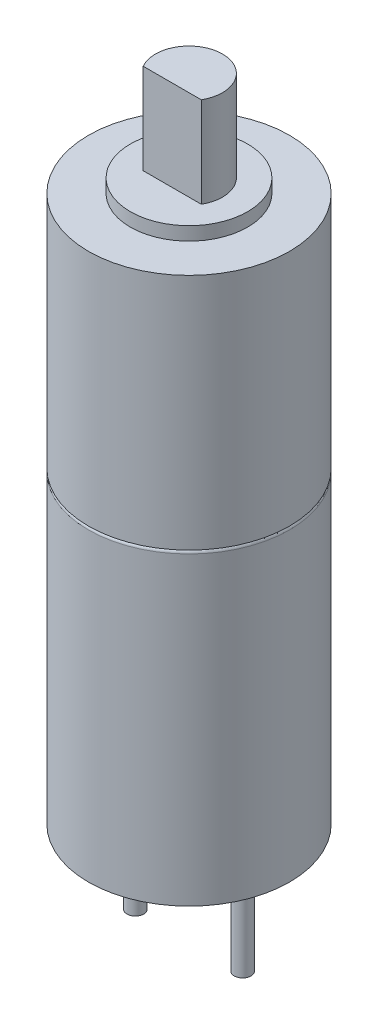
ISO-10303-21;
HEADER;
FILE_DESCRIPTION(('STEP AP214'),'2;1');
FILE_NAME('part.step','',(''),(''),'','','');
FILE_SCHEMA(('AUTOMOTIVE_DESIGN { 1 0 10303 214 1 1 1 1 }'));
ENDSEC;
DATA;
#1=APPLICATION_CONTEXT('core data for automotive mechanical design processes');
#2=APPLICATION_PROTOCOL_DEFINITION('international standard','automotive_design',2000,#1);
#3=PRODUCT_CONTEXT('',#1,'mechanical');
#4=PRODUCT('Part','Part','',(#3));
#5=PRODUCT_RELATED_PRODUCT_CATEGORY('part','',(#4));
#6=PRODUCT_DEFINITION_FORMATION('','',#4);
#7=PRODUCT_DEFINITION_CONTEXT('part definition',#1,'design');
#8=PRODUCT_DEFINITION('design','',#6,#7);
#9=PRODUCT_DEFINITION_SHAPE('','',#8);
#10=(LENGTH_UNIT() NAMED_UNIT(*) SI_UNIT(.MILLI.,.METRE.));
#11=(NAMED_UNIT(*) PLANE_ANGLE_UNIT() SI_UNIT($,.RADIAN.));
#12=(NAMED_UNIT(*) SI_UNIT($,.STERADIAN.) SOLID_ANGLE_UNIT());
#13=UNCERTAINTY_MEASURE_WITH_UNIT(LENGTH_MEASURE(1.E-05),#10,'distance_accuracy_value','');
#14=(GEOMETRIC_REPRESENTATION_CONTEXT(3) GLOBAL_UNCERTAINTY_ASSIGNED_CONTEXT((#13)) GLOBAL_UNIT_ASSIGNED_CONTEXT((#10,
#11,#12)) REPRESENTATION_CONTEXT('',''));
#15=CARTESIAN_POINT('',(0.,0.,0.));
#16=DIRECTION('',(0.,0.,1.));
#17=DIRECTION('',(1.,0.,0.));
#18=AXIS2_PLACEMENT_3D('',#15,#16,#17);
#19=CARTESIAN_POINT('',(0.,16.7,0.));
#20=DIRECTION('',(0.,1.,0.));
#21=DIRECTION('',(0.,0.,1.));
#22=AXIS2_PLACEMENT_3D('',#19,#20,#21);
#23=PLANE('',#22);
#24=CARTESIAN_POINT('',(0.,16.7,0.));
#25=DIRECTION('',(0.,1.,0.));
#26=DIRECTION('',(0.,0.,1.));
#27=AXIS2_PLACEMENT_3D('',#24,#25,#26);
#28=CIRCLE('',#27,1.75);
#29=CARTESIAN_POINT('',(0.,16.7,1.75));
#30=VERTEX_POINT('',#29);
#31=EDGE_CURVE('E79',#30,#30,#28,.T.);
#32=ORIENTED_EDGE('',*,*,#31,.T.);
#33=EDGE_LOOP('',(#32));
#34=FACE_BOUND('',#33,.T.);
#35=DIRECTION('',(-1.,0.,0.));
#36=VECTOR('',#35,1.);
#37=CARTESIAN_POINT('',(0.,16.7,0.5));
#38=LINE('',#37,#36);
#39=CARTESIAN_POINT('',(0.866025403784439,16.7,0.5));
#40=VERTEX_POINT('',#39);
#41=CARTESIAN_POINT('',(-0.866025403784439,16.7,0.5));
#42=VERTEX_POINT('',#41);
#43=EDGE_CURVE('E56',#40,#42,#38,.T.);
#44=ORIENTED_EDGE('',*,*,#43,.T.);
#45=CARTESIAN_POINT('',(0.,16.7,0.));
#46=DIRECTION('',(0.,1.,0.));
#47=DIRECTION('',(0.,0.,1.));
#48=AXIS2_PLACEMENT_3D('',#45,#46,#47);
#49=CIRCLE('',#48,1.);
#50=EDGE_CURVE('E101',#42,#40,#49,.F.);
#51=ORIENTED_EDGE('',*,*,#50,.T.);
#52=EDGE_LOOP('',(#44,#51));
#53=FACE_BOUND('',#52,.T.);
#54=ADVANCED_FACE('F36',(#34,#53),#23,.T.);
#55=CARTESIAN_POINT('',(0.,9.2,0.));
#56=DIRECTION('',(0.,-1.,0.));
#57=DIRECTION('',(0.,0.,-1.));
#58=AXIS2_PLACEMENT_3D('',#55,#56,#57);
#59=CYLINDRICAL_SURFACE('',#58,3.);
#60=CARTESIAN_POINT('',(0.,9.1,0.));
#61=DIRECTION('',(0.,1.,0.));
#62=DIRECTION('',(0.,0.,1.));
#63=AXIS2_PLACEMENT_3D('',#60,#61,#62);
#64=CIRCLE('',#63,3.);
#65=CARTESIAN_POINT('',(0.,9.1,3.));
#66=VERTEX_POINT('',#65);
#67=EDGE_CURVE('E97',#66,#66,#64,.F.);
#68=ORIENTED_EDGE('',*,*,#67,.T.);
#69=EDGE_LOOP('',(#68));
#70=FACE_BOUND('',#69,.T.);
#71=CARTESIAN_POINT('',(0.,0.,0.));
#72=DIRECTION('',(0.,1.,0.));
#73=DIRECTION('',(0.,0.,1.));
#74=AXIS2_PLACEMENT_3D('',#71,#72,#73);
#75=CIRCLE('',#74,3.);
#76=CARTESIAN_POINT('',(0.,0.,3.));
#77=VERTEX_POINT('',#76);
#78=EDGE_CURVE('E89',#77,#77,#75,.T.);
#79=ORIENTED_EDGE('',*,*,#78,.T.);
#80=EDGE_LOOP('',(#79));
#81=FACE_BOUND('',#80,.T.);
#82=ADVANCED_FACE('F110',(#70,#81),#59,.T.);
#83=CARTESIAN_POINT('',(0.,0.,0.));
#84=DIRECTION('',(0.,1.,0.));
#85=DIRECTION('',(0.,0.,1.));
#86=AXIS2_PLACEMENT_3D('',#83,#84,#85);
#87=PLANE('',#86);
#88=CARTESIAN_POINT('',(1.6,0.,0.));
#89=DIRECTION('',(0.,1.,0.));
#90=DIRECTION('',(0.,0.,1.));
#91=AXIS2_PLACEMENT_3D('',#88,#89,#90);
#92=CIRCLE('',#91,0.25);
#93=CARTESIAN_POINT('',(1.6,0.,0.25));
#94=VERTEX_POINT('',#93);
#95=EDGE_CURVE('E12',#94,#94,#92,.F.);
#96=ORIENTED_EDGE('',*,*,#95,.F.);
#97=EDGE_LOOP('',(#96));
#98=FACE_BOUND('',#97,.T.);
#99=CARTESIAN_POINT('',(-1.6,0.,0.));
#100=DIRECTION('',(0.,1.,0.));
#101=DIRECTION('',(0.,0.,1.));
#102=AXIS2_PLACEMENT_3D('',#99,#100,#101);
#103=CIRCLE('',#102,0.25);
#104=CARTESIAN_POINT('',(-1.6,0.,0.25));
#105=VERTEX_POINT('',#104);
#106=EDGE_CURVE('E44',#105,#105,#103,.F.);
#107=ORIENTED_EDGE('',*,*,#106,.F.);
#108=EDGE_LOOP('',(#107));
#109=FACE_BOUND('',#108,.T.);
#110=ORIENTED_EDGE('',*,*,#78,.F.);
#111=EDGE_LOOP('',(#110));
#112=FACE_BOUND('',#111,.T.);
#113=ADVANCED_FACE('F107',(#98,#109,#112),#87,.F.);
#114=CARTESIAN_POINT('',(0.,9.1,0.));
#115=DIRECTION('',(0.,1.,0.));
#116=DIRECTION('',(0.,0.,1.));
#117=AXIS2_PLACEMENT_3D('',#114,#115,#116);
#118=TOROIDAL_SURFACE('',#117,2.9,0.1);
#119=ORIENTED_EDGE('',*,*,#67,.F.);
#120=EDGE_LOOP('',(#119));
#121=FACE_BOUND('',#120,.T.);
#122=CARTESIAN_POINT('',(0.,9.2,0.));
#123=DIRECTION('',(0.,1.,0.));
#124=DIRECTION('',(0.,0.,1.));
#125=AXIS2_PLACEMENT_3D('',#122,#123,#124);
#126=CIRCLE('',#125,2.9);
#127=CARTESIAN_POINT('',(0.,9.2,2.9));
#128=VERTEX_POINT('',#127);
#129=EDGE_CURVE('E94',#128,#128,#126,.T.);
#130=ORIENTED_EDGE('',*,*,#129,.F.);
#131=EDGE_LOOP('',(#130));
#132=FACE_BOUND('',#131,.T.);
#133=ADVANCED_FACE('F38',(#121,#132),#118,.T.);
#134=CARTESIAN_POINT('',(0.,16.3,0.));
#135=DIRECTION('',(0.,-1.,0.));
#136=DIRECTION('',(0.,0.,-1.));
#137=AXIS2_PLACEMENT_3D('',#134,#135,#136);
#138=CYLINDRICAL_SURFACE('',#137,3.);
#139=CARTESIAN_POINT('',(0.,16.3,0.));
#140=DIRECTION('',(0.,1.,0.));
#141=DIRECTION('',(0.,0.,1.));
#142=AXIS2_PLACEMENT_3D('',#139,#140,#141);
#143=CIRCLE('',#142,3.);
#144=CARTESIAN_POINT('',(0.,16.3,3.));
#145=VERTEX_POINT('',#144);
#146=EDGE_CURVE('E86',#145,#145,#143,.T.);
#147=ORIENTED_EDGE('',*,*,#146,.F.);
#148=EDGE_LOOP('',(#147));
#149=FACE_BOUND('',#148,.T.);
#150=CARTESIAN_POINT('',(0.,9.2,0.));
#151=DIRECTION('',(0.,1.,0.));
#152=DIRECTION('',(0.,0.,1.));
#153=AXIS2_PLACEMENT_3D('',#150,#151,#152);
#154=CIRCLE('',#153,3.);
#155=CARTESIAN_POINT('',(0.,9.2,3.));
#156=VERTEX_POINT('',#155);
#157=EDGE_CURVE('E84',#156,#156,#154,.T.);
#158=ORIENTED_EDGE('',*,*,#157,.T.);
#159=EDGE_LOOP('',(#158));
#160=FACE_BOUND('',#159,.T.);
#161=ADVANCED_FACE('F123',(#149,#160),#138,.T.);
#162=CARTESIAN_POINT('',(0.,16.3,0.));
#163=DIRECTION('',(0.,1.,0.));
#164=DIRECTION('',(0.,0.,1.));
#165=AXIS2_PLACEMENT_3D('',#162,#163,#164);
#166=PLANE('',#165);
#167=CARTESIAN_POINT('',(0.,16.3,0.));
#168=DIRECTION('',(0.,1.,0.));
#169=DIRECTION('',(0.,0.,1.));
#170=AXIS2_PLACEMENT_3D('',#167,#168,#169);
#171=CIRCLE('',#170,1.75);
#172=CARTESIAN_POINT('',(0.,16.3,1.75));
#173=VERTEX_POINT('',#172);
#174=EDGE_CURVE('E76',#173,#173,#171,.T.);
#175=ORIENTED_EDGE('',*,*,#174,.F.);
#176=EDGE_LOOP('',(#175));
#177=FACE_BOUND('',#176,.T.);
#178=ORIENTED_EDGE('',*,*,#146,.T.);
#179=EDGE_LOOP('',(#178));
#180=FACE_BOUND('',#179,.T.);
#181=ADVANCED_FACE('F126',(#177,#180),#166,.T.);
#182=CARTESIAN_POINT('',(0.,9.2,0.));
#183=DIRECTION('',(0.,1.,0.));
#184=DIRECTION('',(0.,0.,1.));
#185=AXIS2_PLACEMENT_3D('',#182,#183,#184);
#186=PLANE('',#185);
#187=ORIENTED_EDGE('',*,*,#129,.T.);
#188=EDGE_LOOP('',(#187));
#189=FACE_BOUND('',#188,.T.);
#190=ORIENTED_EDGE('',*,*,#157,.F.);
#191=EDGE_LOOP('',(#190));
#192=FACE_BOUND('',#191,.T.);
#193=ADVANCED_FACE('F128',(#189,#192),#186,.F.);
#194=CARTESIAN_POINT('',(0.,16.7,0.));
#195=DIRECTION('',(0.,-1.,0.));
#196=DIRECTION('',(0.,0.,-1.));
#197=AXIS2_PLACEMENT_3D('',#194,#195,#196);
#198=CYLINDRICAL_SURFACE('',#197,1.75);
#199=ORIENTED_EDGE('',*,*,#31,.F.);
#200=EDGE_LOOP('',(#199));
#201=FACE_BOUND('',#200,.T.);
#202=ORIENTED_EDGE('',*,*,#174,.T.);
#203=EDGE_LOOP('',(#202));
#204=FACE_BOUND('',#203,.T.);
#205=ADVANCED_FACE('F131',(#201,#204),#198,.T.);
#206=CARTESIAN_POINT('',(0.,19.4,0.));
#207=DIRECTION('',(0.,-1.,0.));
#208=DIRECTION('',(0.,0.,-1.));
#209=AXIS2_PLACEMENT_3D('',#206,#207,#208);
#210=CYLINDRICAL_SURFACE('',#209,1.);
#211=ORIENTED_EDGE('',*,*,#50,.F.);
#212=DIRECTION('',(0.,-1.,0.));
#213=VECTOR('',#212,1.);
#214=CARTESIAN_POINT('',(-0.866025403784439,19.4,0.5));
#215=LINE('',#214,#213);
#216=CARTESIAN_POINT('',(-0.866025403784439,19.4,0.5));
#217=VERTEX_POINT('',#216);
#218=EDGE_CURVE('E51',#217,#42,#215,.T.);
#219=ORIENTED_EDGE('',*,*,#218,.F.);
#220=CARTESIAN_POINT('',(0.,19.4,0.));
#221=DIRECTION('',(0.,1.,0.));
#222=DIRECTION('',(0.,0.,1.));
#223=AXIS2_PLACEMENT_3D('',#220,#221,#222);
#224=CIRCLE('',#223,1.);
#225=CARTESIAN_POINT('',(0.866025403784439,19.4,0.5));
#226=VERTEX_POINT('',#225);
#227=EDGE_CURVE('E64',#226,#217,#224,.T.);
#228=ORIENTED_EDGE('',*,*,#227,.F.);
#229=DIRECTION('',(0.,-1.,0.));
#230=VECTOR('',#229,1.);
#231=CARTESIAN_POINT('',(0.866025403784439,19.4,0.5));
#232=LINE('',#231,#230);
#233=EDGE_CURVE('E67',#226,#40,#232,.T.);
#234=ORIENTED_EDGE('',*,*,#233,.T.);
#235=EDGE_LOOP('',(#211,#219,#228,#234));
#236=FACE_BOUND('',#235,.T.);
#237=ADVANCED_FACE('F66',(#236),#210,.T.);
#238=CARTESIAN_POINT('',(-0.866025403784439,19.4,0.5));
#239=DIRECTION('',(0.,0.,-1.));
#240=DIRECTION('',(-1.,0.,0.));
#241=AXIS2_PLACEMENT_3D('',#238,#239,#240);
#242=PLANE('',#241);
#243=ORIENTED_EDGE('',*,*,#43,.F.);
#244=ORIENTED_EDGE('',*,*,#233,.F.);
#245=DIRECTION('',(1.,0.,0.));
#246=VECTOR('',#245,1.);
#247=CARTESIAN_POINT('',(0.,19.4,0.5));
#248=LINE('',#247,#246);
#249=EDGE_CURVE('E70',#217,#226,#248,.T.);
#250=ORIENTED_EDGE('',*,*,#249,.F.);
#251=ORIENTED_EDGE('',*,*,#218,.T.);
#252=EDGE_LOOP('',(#243,#244,#250,#251));
#253=FACE_BOUND('',#252,.T.);
#254=ADVANCED_FACE('F75',(#253),#242,.F.);
#255=CARTESIAN_POINT('',(0.,19.4,0.));
#256=DIRECTION('',(0.,1.,0.));
#257=DIRECTION('',(0.,0.,1.));
#258=AXIS2_PLACEMENT_3D('',#255,#256,#257);
#259=PLANE('',#258);
#260=ORIENTED_EDGE('',*,*,#249,.T.);
#261=ORIENTED_EDGE('',*,*,#227,.T.);
#262=EDGE_LOOP('',(#260,#261));
#263=FACE_BOUND('',#262,.T.);
#264=ADVANCED_FACE('F72',(#263),#259,.T.);
#265=CARTESIAN_POINT('',(-1.6,-3.,0.));
#266=DIRECTION('',(0.,1.,0.));
#267=DIRECTION('',(0.,0.,1.));
#268=AXIS2_PLACEMENT_3D('',#265,#266,#267);
#269=CYLINDRICAL_SURFACE('',#268,0.25);
#270=CARTESIAN_POINT('',(-1.6,-3.,0.));
#271=DIRECTION('',(0.,-1.,0.));
#272=DIRECTION('',(0.,0.,-1.));
#273=AXIS2_PLACEMENT_3D('',#270,#271,#272);
#274=CIRCLE('',#273,0.25);
#275=CARTESIAN_POINT('',(-1.6,-3.,-0.25));
#276=VERTEX_POINT('',#275);
#277=EDGE_CURVE('E73',#276,#276,#274,.T.);
#278=ORIENTED_EDGE('',*,*,#277,.F.);
#279=EDGE_LOOP('',(#278));
#280=FACE_BOUND('',#279,.T.);
#281=ORIENTED_EDGE('',*,*,#106,.T.);
#282=EDGE_LOOP('',(#281));
#283=FACE_BOUND('',#282,.T.);
#284=ADVANCED_FACE('F105',(#280,#283),#269,.T.);
#285=CARTESIAN_POINT('',(-1.6,-3.,0.));
#286=DIRECTION('',(0.,-1.,0.));
#287=DIRECTION('',(0.,0.,-1.));
#288=AXIS2_PLACEMENT_3D('',#285,#286,#287);
#289=PLANE('',#288);
#290=ORIENTED_EDGE('',*,*,#277,.T.);
#291=EDGE_LOOP('',(#290));
#292=FACE_BOUND('',#291,.T.);
#293=ADVANCED_FACE('F147',(#292),#289,.T.);
#294=CARTESIAN_POINT('',(1.6,-3.,0.));
#295=DIRECTION('',(0.,1.,0.));
#296=DIRECTION('',(0.,0.,1.));
#297=AXIS2_PLACEMENT_3D('',#294,#295,#296);
#298=CYLINDRICAL_SURFACE('',#297,0.25);
#299=CARTESIAN_POINT('',(1.6,-3.,0.));
#300=DIRECTION('',(0.,-1.,0.));
#301=DIRECTION('',(0.,0.,1.));
#302=AXIS2_PLACEMENT_3D('',#299,#300,#301);
#303=CIRCLE('',#302,0.25);
#304=CARTESIAN_POINT('',(1.6,-3.,0.25));
#305=VERTEX_POINT('',#304);
#306=EDGE_CURVE('E163',#305,#305,#303,.T.);
#307=ORIENTED_EDGE('',*,*,#306,.F.);
#308=EDGE_LOOP('',(#307));
#309=FACE_BOUND('',#308,.T.);
#310=ORIENTED_EDGE('',*,*,#95,.T.);
#311=EDGE_LOOP('',(#310));
#312=FACE_BOUND('',#311,.T.);
#313=ADVANCED_FACE('F151',(#309,#312),#298,.T.);
#314=CARTESIAN_POINT('',(1.6,-3.,0.));
#315=DIRECTION('',(0.,1.,0.));
#316=DIRECTION('',(0.,0.,1.));
#317=AXIS2_PLACEMENT_3D('',#314,#315,#316);
#318=PLANE('',#317);
#319=ORIENTED_EDGE('',*,*,#306,.T.);
#320=EDGE_LOOP('',(#319));
#321=FACE_BOUND('',#320,.T.);
#322=ADVANCED_FACE('F155',(#321),#318,.F.);
#323=CLOSED_SHELL('',(#54,#82,#113,#133,#161,#181,#193,#205,#237,#254,#264,#284,#293,#313,#322));
#324=MANIFOLD_SOLID_BREP('B2',#323);
#325=ADVANCED_BREP_SHAPE_REPRESENTATION('',(#18,#324),#14);
#326=SHAPE_DEFINITION_REPRESENTATION(#9,#325);
ENDSEC;
END-ISO-10303-21;
